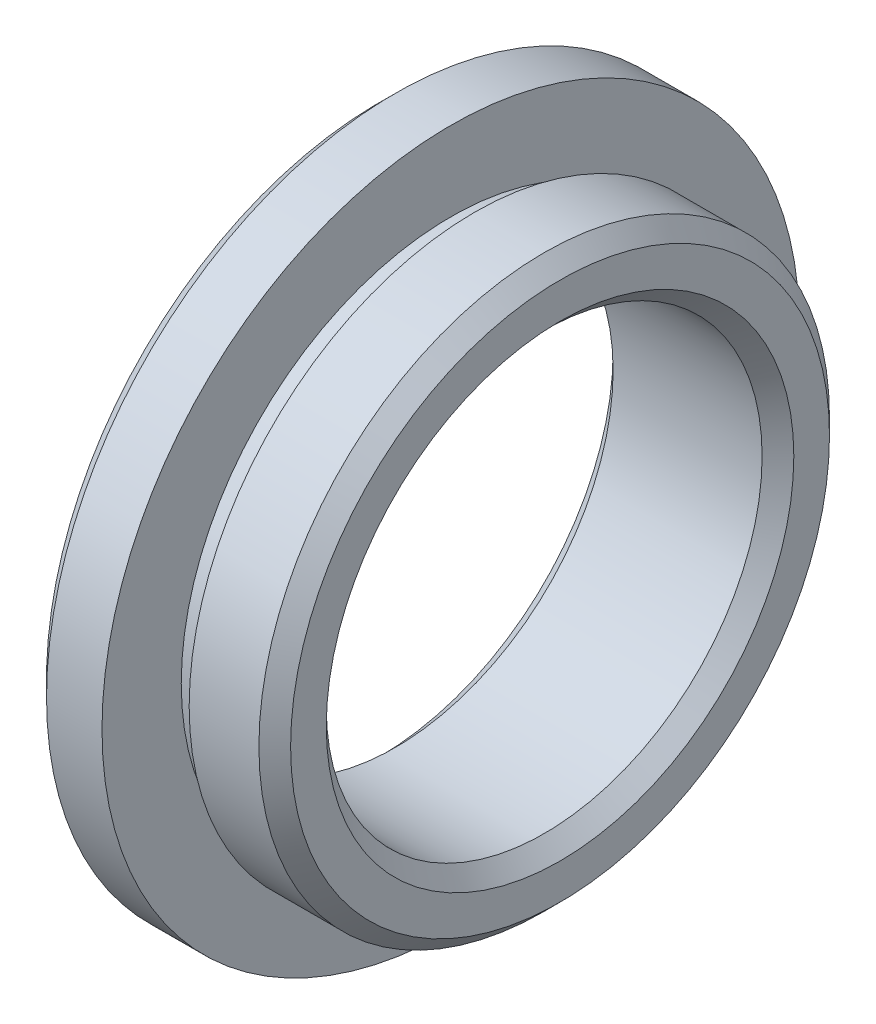
ISO-10303-21;
HEADER;
FILE_DESCRIPTION(('STEP AP214'),'2;1');
FILE_NAME('part.step','',(''),(''),'','','');
FILE_SCHEMA(('AUTOMOTIVE_DESIGN { 1 0 10303 214 1 1 1 1 }'));
ENDSEC;
DATA;
#1=APPLICATION_CONTEXT('core data for automotive mechanical design processes');
#2=APPLICATION_PROTOCOL_DEFINITION('international standard','automotive_design',2000,#1);
#3=PRODUCT_CONTEXT('',#1,'mechanical');
#4=PRODUCT('Part','Part','',(#3));
#5=PRODUCT_RELATED_PRODUCT_CATEGORY('part','',(#4));
#6=PRODUCT_DEFINITION_FORMATION('','',#4);
#7=PRODUCT_DEFINITION_CONTEXT('part definition',#1,'design');
#8=PRODUCT_DEFINITION('design','',#6,#7);
#9=PRODUCT_DEFINITION_SHAPE('','',#8);
#10=(LENGTH_UNIT() NAMED_UNIT(*) SI_UNIT(.MILLI.,.METRE.));
#11=(NAMED_UNIT(*) PLANE_ANGLE_UNIT() SI_UNIT($,.RADIAN.));
#12=(NAMED_UNIT(*) SI_UNIT($,.STERADIAN.) SOLID_ANGLE_UNIT());
#13=UNCERTAINTY_MEASURE_WITH_UNIT(LENGTH_MEASURE(1.E-05),#10,'distance_accuracy_value','');
#14=(GEOMETRIC_REPRESENTATION_CONTEXT(3) GLOBAL_UNCERTAINTY_ASSIGNED_CONTEXT((#13)) GLOBAL_UNIT_ASSIGNED_CONTEXT((#10,
#11,#12)) REPRESENTATION_CONTEXT('',''));
#15=CARTESIAN_POINT('',(0.,0.,0.));
#16=DIRECTION('',(0.,0.,1.));
#17=DIRECTION('',(1.,0.,0.));
#18=AXIS2_PLACEMENT_3D('',#15,#16,#17);
#19=CARTESIAN_POINT('',(0.,0.,0.));
#20=DIRECTION('',(-1.,0.,0.));
#21=DIRECTION('',(0.,0.,1.));
#22=AXIS2_PLACEMENT_3D('',#19,#20,#21);
#23=CYLINDRICAL_SURFACE('',#22,13.75);
#24=CARTESIAN_POINT('',(1.00000000000001,0.,0.));
#25=DIRECTION('',(1.,0.,0.));
#26=DIRECTION('',(0.,0.,-1.));
#27=AXIS2_PLACEMENT_3D('',#24,#25,#26);
#28=CIRCLE('',#27,13.75);
#29=CARTESIAN_POINT('',(1.00000000000001,0.,-13.75));
#30=VERTEX_POINT('',#29);
#31=EDGE_CURVE('E83',#30,#30,#28,.F.);
#32=ORIENTED_EDGE('',*,*,#31,.T.);
#33=EDGE_LOOP('',(#32));
#34=FACE_BOUND('',#33,.T.);
#35=CARTESIAN_POINT('',(10.4,0.,0.));
#36=DIRECTION('',(-1.,0.,0.));
#37=DIRECTION('',(0.,0.,1.));
#38=AXIS2_PLACEMENT_3D('',#35,#36,#37);
#39=CIRCLE('',#38,13.75);
#40=CARTESIAN_POINT('',(10.4,0.,13.75));
#41=VERTEX_POINT('',#40);
#42=EDGE_CURVE('E80',#41,#41,#39,.F.);
#43=ORIENTED_EDGE('',*,*,#42,.T.);
#44=EDGE_LOOP('',(#43));
#45=FACE_BOUND('',#44,.T.);
#46=ADVANCED_FACE('F34',(#34,#45),#23,.F.);
#47=CARTESIAN_POINT('',(0.,13.75,0.));
#48=DIRECTION('',(1.,0.,0.));
#49=DIRECTION('',(0.,0.,-1.));
#50=AXIS2_PLACEMENT_3D('',#47,#48,#49);
#51=PLANE('',#50);
#52=CARTESIAN_POINT('',(0.,-18.5,0.));
#53=DIRECTION('',(-1.,0.,0.));
#54=DIRECTION('',(0.,0.,1.));
#55=AXIS2_PLACEMENT_3D('',#52,#53,#54);
#56=CIRCLE('',#55,1.55);
#57=CARTESIAN_POINT('',(0.,-18.5,1.55));
#58=VERTEX_POINT('',#57);
#59=EDGE_CURVE('E58',#58,#58,#56,.T.);
#60=ORIENTED_EDGE('',*,*,#59,.F.);
#61=EDGE_LOOP('',(#60));
#62=FACE_BOUND('',#61,.T.);
#63=CARTESIAN_POINT('',(0.,18.5,0.));
#64=DIRECTION('',(-1.,0.,0.));
#65=DIRECTION('',(0.,0.,1.));
#66=AXIS2_PLACEMENT_3D('',#63,#64,#65);
#67=CIRCLE('',#66,1.55);
#68=CARTESIAN_POINT('',(0.,18.5,1.55));
#69=VERTEX_POINT('',#68);
#70=EDGE_CURVE('E57',#69,#69,#67,.T.);
#71=ORIENTED_EDGE('',*,*,#70,.F.);
#72=EDGE_LOOP('',(#71));
#73=FACE_BOUND('',#72,.T.);
#74=CARTESIAN_POINT('',(0.,0.,0.));
#75=DIRECTION('',(1.,0.,0.));
#76=DIRECTION('',(0.,0.,-1.));
#77=AXIS2_PLACEMENT_3D('',#74,#75,#76);
#78=CIRCLE('',#77,14.75);
#79=CARTESIAN_POINT('',(0.,0.,-14.75));
#80=VERTEX_POINT('',#79);
#81=EDGE_CURVE('E89',#80,#80,#78,.T.);
#82=ORIENTED_EDGE('',*,*,#81,.T.);
#83=EDGE_LOOP('',(#82));
#84=FACE_BOUND('',#83,.T.);
#85=CARTESIAN_POINT('',(0.,0.,0.));
#86=DIRECTION('',(1.,0.,0.));
#87=DIRECTION('',(0.,0.,-1.));
#88=AXIS2_PLACEMENT_3D('',#85,#86,#87);
#89=CIRCLE('',#88,21.);
#90=CARTESIAN_POINT('',(0.,0.,-21.));
#91=VERTEX_POINT('',#90);
#92=EDGE_CURVE('E86',#91,#91,#89,.F.);
#93=ORIENTED_EDGE('',*,*,#92,.T.);
#94=EDGE_LOOP('',(#93));
#95=FACE_BOUND('',#94,.T.);
#96=ADVANCED_FACE('F111',(#62,#73,#84,#95),#51,.F.);
#97=CARTESIAN_POINT('',(0.,0.,0.));
#98=DIRECTION('',(-1.,0.,0.));
#99=DIRECTION('',(0.,0.,1.));
#100=AXIS2_PLACEMENT_3D('',#97,#98,#99);
#101=CYLINDRICAL_SURFACE('',#100,22.);
#102=CARTESIAN_POINT('',(1.,0.,0.));
#103=DIRECTION('',(1.,0.,0.));
#104=DIRECTION('',(0.,0.,-1.));
#105=AXIS2_PLACEMENT_3D('',#102,#103,#104);
#106=CIRCLE('',#105,22.);
#107=CARTESIAN_POINT('',(1.,0.,-22.));
#108=VERTEX_POINT('',#107);
#109=EDGE_CURVE('E41',#108,#108,#106,.T.);
#110=ORIENTED_EDGE('',*,*,#109,.T.);
#111=EDGE_LOOP('',(#110));
#112=FACE_BOUND('',#111,.T.);
#113=CARTESIAN_POINT('',(4.5,0.,0.));
#114=DIRECTION('',(-1.,0.,0.));
#115=DIRECTION('',(0.,0.,1.));
#116=AXIS2_PLACEMENT_3D('',#113,#114,#115);
#117=CIRCLE('',#116,22.);
#118=CARTESIAN_POINT('',(4.5,0.,22.));
#119=VERTEX_POINT('',#118);
#120=EDGE_CURVE('E77',#119,#119,#117,.T.);
#121=ORIENTED_EDGE('',*,*,#120,.T.);
#122=EDGE_LOOP('',(#121));
#123=FACE_BOUND('',#122,.T.);
#124=ADVANCED_FACE('F100',(#112,#123),#101,.T.);
#125=CARTESIAN_POINT('',(4.5,22.,0.));
#126=DIRECTION('',(-1.,0.,0.));
#127=DIRECTION('',(0.,0.,1.));
#128=AXIS2_PLACEMENT_3D('',#125,#126,#127);
#129=PLANE('',#128);
#130=ORIENTED_EDGE('',*,*,#120,.F.);
#131=EDGE_LOOP('',(#130));
#132=FACE_BOUND('',#131,.T.);
#133=CARTESIAN_POINT('',(4.5,0.,0.));
#134=DIRECTION('',(-1.,0.,0.));
#135=DIRECTION('',(0.,0.,1.));
#136=AXIS2_PLACEMENT_3D('',#133,#134,#135);
#137=CIRCLE('',#136,17.);
#138=CARTESIAN_POINT('',(4.5,0.,17.));
#139=VERTEX_POINT('',#138);
#140=EDGE_CURVE('E74',#139,#139,#137,.T.);
#141=ORIENTED_EDGE('',*,*,#140,.T.);
#142=EDGE_LOOP('',(#141));
#143=FACE_BOUND('',#142,.T.);
#144=ADVANCED_FACE('F118',(#132,#143),#129,.F.);
#145=CARTESIAN_POINT('',(0.,0.,0.));
#146=DIRECTION('',(-1.,0.,0.));
#147=DIRECTION('',(0.,0.,1.));
#148=AXIS2_PLACEMENT_3D('',#145,#146,#147);
#149=CYLINDRICAL_SURFACE('',#148,17.);
#150=ORIENTED_EDGE('',*,*,#140,.F.);
#151=EDGE_LOOP('',(#150));
#152=FACE_BOUND('',#151,.T.);
#153=CARTESIAN_POINT('',(6.,0.,0.));
#154=DIRECTION('',(-1.,0.,0.));
#155=DIRECTION('',(0.,0.,1.));
#156=AXIS2_PLACEMENT_3D('',#153,#154,#155);
#157=CIRCLE('',#156,17.);
#158=CARTESIAN_POINT('',(6.,0.,17.));
#159=VERTEX_POINT('',#158);
#160=EDGE_CURVE('E71',#159,#159,#157,.T.);
#161=ORIENTED_EDGE('',*,*,#160,.T.);
#162=EDGE_LOOP('',(#161));
#163=FACE_BOUND('',#162,.T.);
#164=ADVANCED_FACE('F126',(#152,#163),#149,.T.);
#165=CARTESIAN_POINT('',(6.,17.,0.));
#166=DIRECTION('',(1.,0.,0.));
#167=DIRECTION('',(0.,0.,-1.));
#168=AXIS2_PLACEMENT_3D('',#165,#166,#167);
#169=PLANE('',#168);
#170=ORIENTED_EDGE('',*,*,#160,.F.);
#171=EDGE_LOOP('',(#170));
#172=FACE_BOUND('',#171,.T.);
#173=CARTESIAN_POINT('',(6.,0.,0.));
#174=DIRECTION('',(-1.,0.,0.));
#175=DIRECTION('',(0.,0.,1.));
#176=AXIS2_PLACEMENT_3D('',#173,#174,#175);
#177=CIRCLE('',#176,18.);
#178=CARTESIAN_POINT('',(6.,0.,18.));
#179=VERTEX_POINT('',#178);
#180=EDGE_CURVE('E68',#179,#179,#177,.T.);
#181=ORIENTED_EDGE('',*,*,#180,.T.);
#182=EDGE_LOOP('',(#181));
#183=FACE_BOUND('',#182,.T.);
#184=ADVANCED_FACE('F130',(#172,#183),#169,.F.);
#185=CARTESIAN_POINT('',(0.,0.,0.));
#186=DIRECTION('',(-1.,0.,0.));
#187=DIRECTION('',(0.,0.,1.));
#188=AXIS2_PLACEMENT_3D('',#185,#186,#187);
#189=CYLINDRICAL_SURFACE('',#188,18.);
#190=CARTESIAN_POINT('',(10.4,0.,0.));
#191=DIRECTION('',(-1.,0.,0.));
#192=DIRECTION('',(0.,0.,1.));
#193=AXIS2_PLACEMENT_3D('',#190,#191,#192);
#194=CIRCLE('',#193,18.);
#195=CARTESIAN_POINT('',(10.4,0.,18.));
#196=VERTEX_POINT('',#195);
#197=EDGE_CURVE('E11',#196,#196,#194,.T.);
#198=ORIENTED_EDGE('',*,*,#197,.T.);
#199=EDGE_LOOP('',(#198));
#200=FACE_BOUND('',#199,.T.);
#201=ORIENTED_EDGE('',*,*,#180,.F.);
#202=EDGE_LOOP('',(#201));
#203=FACE_BOUND('',#202,.T.);
#204=ADVANCED_FACE('F134',(#200,#203),#189,.T.);
#205=CARTESIAN_POINT('',(11.4,18.,0.));
#206=DIRECTION('',(-1.,0.,0.));
#207=DIRECTION('',(0.,0.,1.));
#208=AXIS2_PLACEMENT_3D('',#205,#206,#207);
#209=PLANE('',#208);
#210=CARTESIAN_POINT('',(11.4,0.,0.));
#211=DIRECTION('',(-1.,0.,0.));
#212=DIRECTION('',(0.,0.,1.));
#213=AXIS2_PLACEMENT_3D('',#210,#211,#212);
#214=CIRCLE('',#213,14.75);
#215=CARTESIAN_POINT('',(11.4,0.,14.75));
#216=VERTEX_POINT('',#215);
#217=EDGE_CURVE('E95',#216,#216,#214,.T.);
#218=ORIENTED_EDGE('',*,*,#217,.T.);
#219=EDGE_LOOP('',(#218));
#220=FACE_BOUND('',#219,.T.);
#221=CARTESIAN_POINT('',(11.4,0.,0.));
#222=DIRECTION('',(-1.,0.,0.));
#223=DIRECTION('',(0.,0.,1.));
#224=AXIS2_PLACEMENT_3D('',#221,#222,#223);
#225=CIRCLE('',#224,17.);
#226=CARTESIAN_POINT('',(11.4,0.,17.));
#227=VERTEX_POINT('',#226);
#228=EDGE_CURVE('E92',#227,#227,#225,.F.);
#229=ORIENTED_EDGE('',*,*,#228,.T.);
#230=EDGE_LOOP('',(#229));
#231=FACE_BOUND('',#230,.T.);
#232=ADVANCED_FACE('F138',(#220,#231),#209,.F.);
#233=CARTESIAN_POINT('',(1.00000000000001,0.,0.));
#234=DIRECTION('',(-1.,0.,0.));
#235=DIRECTION('',(0.,0.,1.));
#236=AXIS2_PLACEMENT_3D('',#233,#234,#235);
#237=CONICAL_SURFACE('',#236,13.75,0.785398163397447);
#238=ORIENTED_EDGE('',*,*,#81,.F.);
#239=EDGE_LOOP('',(#238));
#240=FACE_BOUND('',#239,.T.);
#241=ORIENTED_EDGE('',*,*,#31,.F.);
#242=EDGE_LOOP('',(#241));
#243=FACE_BOUND('',#242,.T.);
#244=ADVANCED_FACE('F142',(#240,#243),#237,.F.);
#245=CARTESIAN_POINT('',(11.4,0.,0.));
#246=DIRECTION('',(1.,0.,0.));
#247=DIRECTION('',(0.,0.,-1.));
#248=AXIS2_PLACEMENT_3D('',#245,#246,#247);
#249=CONICAL_SURFACE('',#248,14.75,0.785398163397445);
#250=ORIENTED_EDGE('',*,*,#42,.F.);
#251=EDGE_LOOP('',(#250));
#252=FACE_BOUND('',#251,.T.);
#253=ORIENTED_EDGE('',*,*,#217,.F.);
#254=EDGE_LOOP('',(#253));
#255=FACE_BOUND('',#254,.T.);
#256=ADVANCED_FACE('F107',(#252,#255),#249,.F.);
#257=CARTESIAN_POINT('',(0.,0.,0.));
#258=DIRECTION('',(1.,0.,0.));
#259=DIRECTION('',(0.,0.,-1.));
#260=AXIS2_PLACEMENT_3D('',#257,#258,#259);
#261=CONICAL_SURFACE('',#260,21.,0.785398163397447);
#262=ORIENTED_EDGE('',*,*,#109,.F.);
#263=EDGE_LOOP('',(#262));
#264=FACE_BOUND('',#263,.T.);
#265=ORIENTED_EDGE('',*,*,#92,.F.);
#266=EDGE_LOOP('',(#265));
#267=FACE_BOUND('',#266,.T.);
#268=ADVANCED_FACE('F103',(#264,#267),#261,.T.);
#269=CARTESIAN_POINT('',(10.4,0.,0.));
#270=DIRECTION('',(-1.,0.,0.));
#271=DIRECTION('',(0.,0.,1.));
#272=AXIS2_PLACEMENT_3D('',#269,#270,#271);
#273=CONICAL_SURFACE('',#272,18.,0.785398163397448);
#274=ORIENTED_EDGE('',*,*,#228,.F.);
#275=EDGE_LOOP('',(#274));
#276=FACE_BOUND('',#275,.T.);
#277=ORIENTED_EDGE('',*,*,#197,.F.);
#278=EDGE_LOOP('',(#277));
#279=FACE_BOUND('',#278,.T.);
#280=ADVANCED_FACE('F106',(#276,#279),#273,.T.);
#281=CARTESIAN_POINT('',(3.1,18.5,0.));
#282=DIRECTION('',(-1.,0.,0.));
#283=DIRECTION('',(0.,0.,1.));
#284=AXIS2_PLACEMENT_3D('',#281,#282,#283);
#285=CONICAL_SURFACE('',#284,1.55,1.02974425867665);
#286=CARTESIAN_POINT('',(4.03133395949272,18.5,0.));
#287=VERTEX_POINT('',#286);
#288=VERTEX_LOOP('',#287);
#289=FACE_BOUND('',#288,.T.);
#290=CARTESIAN_POINT('',(3.1,18.5,0.));
#291=DIRECTION('',(-1.,0.,0.));
#292=DIRECTION('',(0.,0.,1.));
#293=AXIS2_PLACEMENT_3D('',#290,#291,#292);
#294=CIRCLE('',#293,1.55);
#295=CARTESIAN_POINT('',(3.1,18.5,1.55));
#296=VERTEX_POINT('',#295);
#297=EDGE_CURVE('E61',#296,#296,#294,.T.);
#298=ORIENTED_EDGE('',*,*,#297,.T.);
#299=EDGE_LOOP('',(#298));
#300=FACE_BOUND('',#299,.T.);
#301=ADVANCED_FACE('F152',(#289,#300),#285,.F.);
#302=CARTESIAN_POINT('',(0.,18.5,0.));
#303=DIRECTION('',(-1.,0.,0.));
#304=DIRECTION('',(0.,0.,1.));
#305=AXIS2_PLACEMENT_3D('',#302,#303,#304);
#306=CYLINDRICAL_SURFACE('',#305,1.55);
#307=ORIENTED_EDGE('',*,*,#297,.F.);
#308=EDGE_LOOP('',(#307));
#309=FACE_BOUND('',#308,.T.);
#310=ORIENTED_EDGE('',*,*,#70,.T.);
#311=EDGE_LOOP('',(#310));
#312=FACE_BOUND('',#311,.T.);
#313=ADVANCED_FACE('F51',(#309,#312),#306,.F.);
#314=CARTESIAN_POINT('',(3.1,-18.5,0.));
#315=DIRECTION('',(-1.,0.,0.));
#316=DIRECTION('',(0.,0.,1.));
#317=AXIS2_PLACEMENT_3D('',#314,#315,#316);
#318=CONICAL_SURFACE('',#317,1.55,1.02974425867665);
#319=CARTESIAN_POINT('',(4.03133395949272,-18.5,0.));
#320=VERTEX_POINT('',#319);
#321=VERTEX_LOOP('',#320);
#322=FACE_BOUND('',#321,.T.);
#323=CARTESIAN_POINT('',(3.1,-18.5,0.));
#324=DIRECTION('',(-1.,0.,0.));
#325=DIRECTION('',(0.,0.,1.));
#326=AXIS2_PLACEMENT_3D('',#323,#324,#325);
#327=CIRCLE('',#326,1.55);
#328=CARTESIAN_POINT('',(3.1,-18.5,1.55));
#329=VERTEX_POINT('',#328);
#330=EDGE_CURVE('E55',#329,#329,#327,.T.);
#331=ORIENTED_EDGE('',*,*,#330,.T.);
#332=EDGE_LOOP('',(#331));
#333=FACE_BOUND('',#332,.T.);
#334=ADVANCED_FACE('F47',(#322,#333),#318,.F.);
#335=CARTESIAN_POINT('',(0.,-18.5,0.));
#336=DIRECTION('',(-1.,0.,0.));
#337=DIRECTION('',(0.,0.,1.));
#338=AXIS2_PLACEMENT_3D('',#335,#336,#337);
#339=CYLINDRICAL_SURFACE('',#338,1.55);
#340=ORIENTED_EDGE('',*,*,#330,.F.);
#341=EDGE_LOOP('',(#340));
#342=FACE_BOUND('',#341,.T.);
#343=ORIENTED_EDGE('',*,*,#59,.T.);
#344=EDGE_LOOP('',(#343));
#345=FACE_BOUND('',#344,.T.);
#346=ADVANCED_FACE('F50',(#342,#345),#339,.F.);
#347=CLOSED_SHELL('',(#46,#96,#124,#144,#164,#184,#204,#232,#244,#256,#268,#280,#301,#313,#334,#346));
#348=MANIFOLD_SOLID_BREP('B2',#347);
#349=ADVANCED_BREP_SHAPE_REPRESENTATION('',(#18,#348),#14);
#350=SHAPE_DEFINITION_REPRESENTATION(#9,#349);
ENDSEC;
END-ISO-10303-21;
